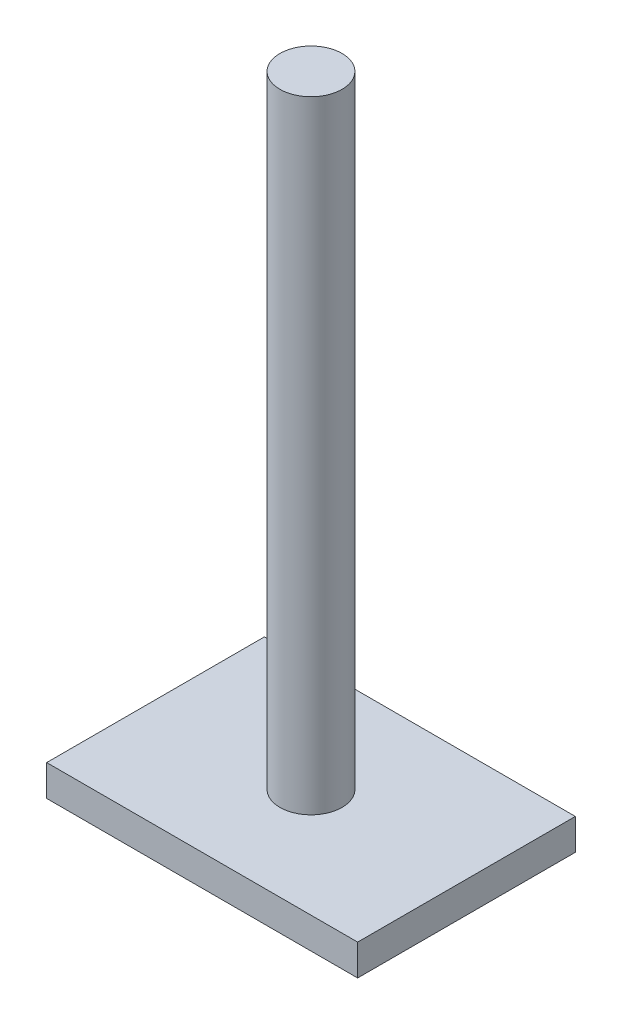
ISO-10303-21;
HEADER;
FILE_DESCRIPTION(('STEP AP214'),'2;1');
FILE_NAME('part.step','',(''),(''),'','','');
FILE_SCHEMA(('AUTOMOTIVE_DESIGN { 1 0 10303 214 1 1 1 1 }'));
ENDSEC;
DATA;
#1=APPLICATION_CONTEXT('core data for automotive mechanical design processes');
#2=APPLICATION_PROTOCOL_DEFINITION('international standard','automotive_design',2000,#1);
#3=PRODUCT_CONTEXT('',#1,'mechanical');
#4=PRODUCT('Part','Part','',(#3));
#5=PRODUCT_RELATED_PRODUCT_CATEGORY('part','',(#4));
#6=PRODUCT_DEFINITION_FORMATION('','',#4);
#7=PRODUCT_DEFINITION_CONTEXT('part definition',#1,'design');
#8=PRODUCT_DEFINITION('design','',#6,#7);
#9=PRODUCT_DEFINITION_SHAPE('','',#8);
#10=(LENGTH_UNIT() NAMED_UNIT(*) SI_UNIT(.MILLI.,.METRE.));
#11=(NAMED_UNIT(*) PLANE_ANGLE_UNIT() SI_UNIT($,.RADIAN.));
#12=(NAMED_UNIT(*) SI_UNIT($,.STERADIAN.) SOLID_ANGLE_UNIT());
#13=UNCERTAINTY_MEASURE_WITH_UNIT(LENGTH_MEASURE(1.E-05),#10,'distance_accuracy_value','');
#14=(GEOMETRIC_REPRESENTATION_CONTEXT(3) GLOBAL_UNCERTAINTY_ASSIGNED_CONTEXT((#13)) GLOBAL_UNIT_ASSIGNED_CONTEXT((#10,
#11,#12)) REPRESENTATION_CONTEXT('',''));
#15=CARTESIAN_POINT('',(0.,0.,0.));
#16=DIRECTION('',(0.,0.,1.));
#17=DIRECTION('',(1.,0.,0.));
#18=AXIS2_PLACEMENT_3D('',#15,#16,#17);
#19=CARTESIAN_POINT('',(2.5,0.5,-1.75));
#20=DIRECTION('',(-1.,0.,0.));
#21=DIRECTION('',(0.,0.,1.));
#22=AXIS2_PLACEMENT_3D('',#19,#20,#21);
#23=PLANE('',#22);
#24=DIRECTION('',(0.,0.,-1.));
#25=VECTOR('',#24,1.);
#26=CARTESIAN_POINT('',(2.5,0.,-1.75));
#27=LINE('',#26,#25);
#28=CARTESIAN_POINT('',(2.5,0.,1.75));
#29=VERTEX_POINT('',#28);
#30=CARTESIAN_POINT('',(2.5,0.,-1.75));
#31=VERTEX_POINT('',#30);
#32=EDGE_CURVE('E108',#29,#31,#27,.T.);
#33=ORIENTED_EDGE('',*,*,#32,.T.);
#34=DIRECTION('',(0.,-1.,0.));
#35=VECTOR('',#34,1.);
#36=CARTESIAN_POINT('',(2.5,0.5,-1.75));
#37=LINE('',#36,#35);
#38=CARTESIAN_POINT('',(2.5,0.5,-1.75));
#39=VERTEX_POINT('',#38);
#40=EDGE_CURVE('E13',#39,#31,#37,.T.);
#41=ORIENTED_EDGE('',*,*,#40,.F.);
#42=DIRECTION('',(0.,0.,-1.));
#43=VECTOR('',#42,1.);
#44=CARTESIAN_POINT('',(2.5,0.5,-1.75));
#45=LINE('',#44,#43);
#46=CARTESIAN_POINT('',(2.5,0.5,1.75));
#47=VERTEX_POINT('',#46);
#48=EDGE_CURVE('E96',#47,#39,#45,.T.);
#49=ORIENTED_EDGE('',*,*,#48,.F.);
#50=DIRECTION('',(0.,-1.,0.));
#51=VECTOR('',#50,1.);
#52=CARTESIAN_POINT('',(2.5,0.5,1.75));
#53=LINE('',#52,#51);
#54=EDGE_CURVE('E104',#47,#29,#53,.T.);
#55=ORIENTED_EDGE('',*,*,#54,.T.);
#56=EDGE_LOOP('',(#33,#41,#49,#55));
#57=FACE_BOUND('',#56,.T.);
#58=ADVANCED_FACE('F45',(#57),#23,.F.);
#59=CARTESIAN_POINT('',(-2.5,0.5,-1.75));
#60=DIRECTION('',(0.,0.,1.));
#61=DIRECTION('',(1.,0.,0.));
#62=AXIS2_PLACEMENT_3D('',#59,#60,#61);
#63=PLANE('',#62);
#64=DIRECTION('',(-1.,0.,0.));
#65=VECTOR('',#64,1.);
#66=CARTESIAN_POINT('',(-2.5,0.,-1.75));
#67=LINE('',#66,#65);
#68=CARTESIAN_POINT('',(-2.5,0.,-1.75));
#69=VERTEX_POINT('',#68);
#70=EDGE_CURVE('E100',#31,#69,#67,.T.);
#71=ORIENTED_EDGE('',*,*,#70,.T.);
#72=DIRECTION('',(0.,-1.,0.));
#73=VECTOR('',#72,1.);
#74=CARTESIAN_POINT('',(-2.5,0.5,-1.75));
#75=LINE('',#74,#73);
#76=CARTESIAN_POINT('',(-2.5,0.5,-1.75));
#77=VERTEX_POINT('',#76);
#78=EDGE_CURVE('E53',#77,#69,#75,.T.);
#79=ORIENTED_EDGE('',*,*,#78,.F.);
#80=DIRECTION('',(-1.,0.,0.));
#81=VECTOR('',#80,1.);
#82=CARTESIAN_POINT('',(-2.5,0.5,-1.75));
#83=LINE('',#82,#81);
#84=EDGE_CURVE('E91',#39,#77,#83,.T.);
#85=ORIENTED_EDGE('',*,*,#84,.F.);
#86=ORIENTED_EDGE('',*,*,#40,.T.);
#87=EDGE_LOOP('',(#71,#79,#85,#86));
#88=FACE_BOUND('',#87,.T.);
#89=ADVANCED_FACE('F99',(#88),#63,.F.);
#90=CARTESIAN_POINT('',(-2.5,0.5,-1.75));
#91=DIRECTION('',(1.,0.,0.));
#92=DIRECTION('',(0.,0.,-1.));
#93=AXIS2_PLACEMENT_3D('',#90,#91,#92);
#94=PLANE('',#93);
#95=DIRECTION('',(0.,0.,1.));
#96=VECTOR('',#95,1.);
#97=CARTESIAN_POINT('',(-2.5,0.,-1.75));
#98=LINE('',#97,#96);
#99=CARTESIAN_POINT('',(-2.5,0.,1.75));
#100=VERTEX_POINT('',#99);
#101=EDGE_CURVE('E78',#69,#100,#98,.T.);
#102=ORIENTED_EDGE('',*,*,#101,.T.);
#103=DIRECTION('',(0.,-1.,0.));
#104=VECTOR('',#103,1.);
#105=CARTESIAN_POINT('',(-2.5,0.5,1.75));
#106=LINE('',#105,#104);
#107=CARTESIAN_POINT('',(-2.5,0.5,1.75));
#108=VERTEX_POINT('',#107);
#109=EDGE_CURVE('E101',#108,#100,#106,.T.);
#110=ORIENTED_EDGE('',*,*,#109,.F.);
#111=DIRECTION('',(0.,0.,1.));
#112=VECTOR('',#111,1.);
#113=CARTESIAN_POINT('',(-2.5,0.5,-1.75));
#114=LINE('',#113,#112);
#115=EDGE_CURVE('E94',#77,#108,#114,.T.);
#116=ORIENTED_EDGE('',*,*,#115,.F.);
#117=ORIENTED_EDGE('',*,*,#78,.T.);
#118=EDGE_LOOP('',(#102,#110,#116,#117));
#119=FACE_BOUND('',#118,.T.);
#120=ADVANCED_FACE('F102',(#119),#94,.F.);
#121=CARTESIAN_POINT('',(-2.5,0.5,1.75));
#122=DIRECTION('',(0.,0.,-1.));
#123=DIRECTION('',(-1.,0.,0.));
#124=AXIS2_PLACEMENT_3D('',#121,#122,#123);
#125=PLANE('',#124);
#126=DIRECTION('',(1.,0.,0.));
#127=VECTOR('',#126,1.);
#128=CARTESIAN_POINT('',(-2.5,0.,1.75));
#129=LINE('',#128,#127);
#130=EDGE_CURVE('E84',#100,#29,#129,.T.);
#131=ORIENTED_EDGE('',*,*,#130,.T.);
#132=ORIENTED_EDGE('',*,*,#54,.F.);
#133=DIRECTION('',(1.,0.,0.));
#134=VECTOR('',#133,1.);
#135=CARTESIAN_POINT('',(-2.5,0.5,1.75));
#136=LINE('',#135,#134);
#137=EDGE_CURVE('E61',#108,#47,#136,.T.);
#138=ORIENTED_EDGE('',*,*,#137,.F.);
#139=ORIENTED_EDGE('',*,*,#109,.T.);
#140=EDGE_LOOP('',(#131,#132,#138,#139));
#141=FACE_BOUND('',#140,.T.);
#142=ADVANCED_FACE('F116',(#141),#125,.F.);
#143=CARTESIAN_POINT('',(0.,0.5,0.));
#144=DIRECTION('',(0.,1.,0.));
#145=DIRECTION('',(0.,0.,1.));
#146=AXIS2_PLACEMENT_3D('',#143,#144,#145);
#147=PLANE('',#146);
#148=CARTESIAN_POINT('',(0.,0.5,0.));
#149=DIRECTION('',(0.,1.,0.));
#150=DIRECTION('',(0.,0.,1.));
#151=AXIS2_PLACEMENT_3D('',#148,#149,#150);
#152=CIRCLE('',#151,0.499746313835203);
#153=CARTESIAN_POINT('',(0.,0.5,0.499746313835203));
#154=VERTEX_POINT('',#153);
#155=EDGE_CURVE('E122',#154,#154,#152,.T.);
#156=ORIENTED_EDGE('',*,*,#155,.F.);
#157=EDGE_LOOP('',(#156));
#158=FACE_BOUND('',#157,.T.);
#159=ORIENTED_EDGE('',*,*,#48,.T.);
#160=ORIENTED_EDGE('',*,*,#84,.T.);
#161=ORIENTED_EDGE('',*,*,#115,.T.);
#162=ORIENTED_EDGE('',*,*,#137,.T.);
#163=EDGE_LOOP('',(#159,#160,#161,#162));
#164=FACE_BOUND('',#163,.T.);
#165=ADVANCED_FACE('F92',(#158,#164),#147,.T.);
#166=CARTESIAN_POINT('',(0.,0.,0.));
#167=DIRECTION('',(0.,1.,0.));
#168=DIRECTION('',(0.,0.,1.));
#169=AXIS2_PLACEMENT_3D('',#166,#167,#168);
#170=PLANE('',#169);
#171=ORIENTED_EDGE('',*,*,#32,.F.);
#172=ORIENTED_EDGE('',*,*,#130,.F.);
#173=ORIENTED_EDGE('',*,*,#101,.F.);
#174=ORIENTED_EDGE('',*,*,#70,.F.);
#175=EDGE_LOOP('',(#171,#172,#173,#174));
#176=FACE_BOUND('',#175,.T.);
#177=ADVANCED_FACE('F119',(#176),#170,.F.);
#178=CARTESIAN_POINT('',(0.,10.5,0.));
#179=DIRECTION('',(0.,-1.,0.));
#180=DIRECTION('',(0.,0.,-1.));
#181=AXIS2_PLACEMENT_3D('',#178,#179,#180);
#182=CYLINDRICAL_SURFACE('',#181,0.499746313835203);
#183=CARTESIAN_POINT('',(0.,10.5,0.));
#184=DIRECTION('',(0.,1.,0.));
#185=DIRECTION('',(0.,0.,1.));
#186=AXIS2_PLACEMENT_3D('',#183,#184,#185);
#187=CIRCLE('',#186,0.499746313835203);
#188=CARTESIAN_POINT('',(0.,10.5,0.499746313835203));
#189=VERTEX_POINT('',#188);
#190=EDGE_CURVE('E111',#189,#189,#187,.T.);
#191=ORIENTED_EDGE('',*,*,#190,.F.);
#192=EDGE_LOOP('',(#191));
#193=FACE_BOUND('',#192,.T.);
#194=ORIENTED_EDGE('',*,*,#155,.T.);
#195=EDGE_LOOP('',(#194));
#196=FACE_BOUND('',#195,.T.);
#197=ADVANCED_FACE('F130',(#193,#196),#182,.T.);
#198=CARTESIAN_POINT('',(0.,10.5,0.));
#199=DIRECTION('',(0.,1.,0.));
#200=DIRECTION('',(0.,0.,1.));
#201=AXIS2_PLACEMENT_3D('',#198,#199,#200);
#202=PLANE('',#201);
#203=ORIENTED_EDGE('',*,*,#190,.T.);
#204=EDGE_LOOP('',(#203));
#205=FACE_BOUND('',#204,.T.);
#206=ADVANCED_FACE('F128',(#205),#202,.T.);
#207=CLOSED_SHELL('',(#58,#89,#120,#142,#165,#177,#197,#206));
#208=MANIFOLD_SOLID_BREP('B2',#207);
#209=ADVANCED_BREP_SHAPE_REPRESENTATION('',(#18,#208),#14);
#210=SHAPE_DEFINITION_REPRESENTATION(#9,#209);
ENDSEC;
END-ISO-10303-21;
